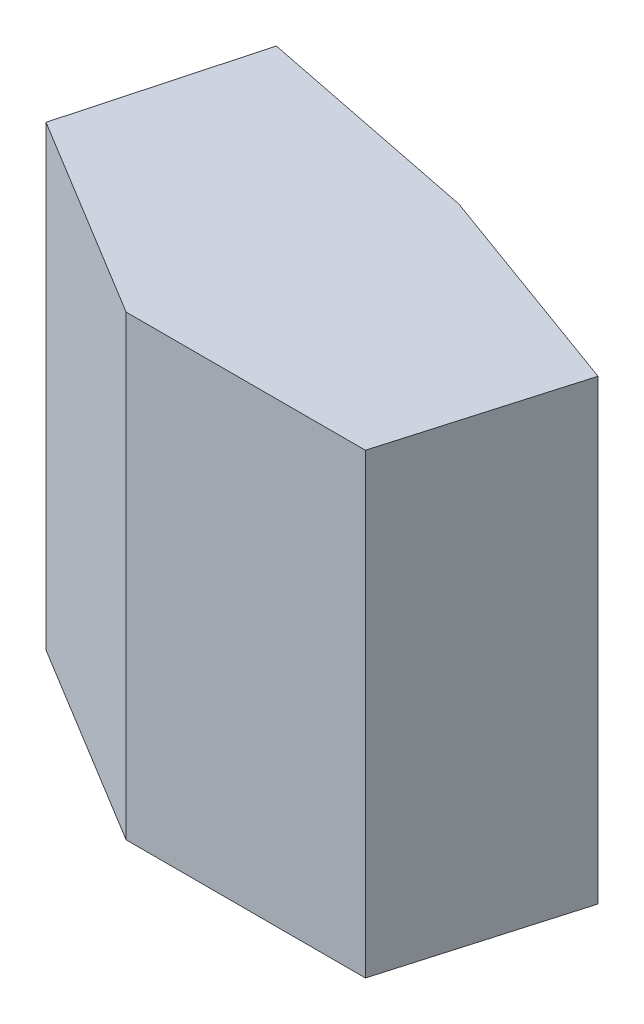
ISO-10303-21;
HEADER;
FILE_DESCRIPTION(('STEP AP214'),'2;1');
FILE_NAME('part.step','',(''),(''),'','','');
FILE_SCHEMA(('AUTOMOTIVE_DESIGN { 1 0 10303 214 1 1 1 1 }'));
ENDSEC;
DATA;
#1=APPLICATION_CONTEXT('core data for automotive mechanical design processes');
#2=APPLICATION_PROTOCOL_DEFINITION('international standard','automotive_design',2000,#1);
#3=PRODUCT_CONTEXT('',#1,'mechanical');
#4=PRODUCT('Part','Part','',(#3));
#5=PRODUCT_RELATED_PRODUCT_CATEGORY('part','',(#4));
#6=PRODUCT_DEFINITION_FORMATION('','',#4);
#7=PRODUCT_DEFINITION_CONTEXT('part definition',#1,'design');
#8=PRODUCT_DEFINITION('design','',#6,#7);
#9=PRODUCT_DEFINITION_SHAPE('','',#8);
#10=(LENGTH_UNIT() NAMED_UNIT(*) SI_UNIT(.MILLI.,.METRE.));
#11=(NAMED_UNIT(*) PLANE_ANGLE_UNIT() SI_UNIT($,.RADIAN.));
#12=(NAMED_UNIT(*) SI_UNIT($,.STERADIAN.) SOLID_ANGLE_UNIT());
#13=UNCERTAINTY_MEASURE_WITH_UNIT(LENGTH_MEASURE(1.E-05),#10,'distance_accuracy_value','');
#14=(GEOMETRIC_REPRESENTATION_CONTEXT(3) GLOBAL_UNCERTAINTY_ASSIGNED_CONTEXT((#13)) GLOBAL_UNIT_ASSIGNED_CONTEXT((#10,
#11,#12)) REPRESENTATION_CONTEXT('',''));
#15=CARTESIAN_POINT('',(0.,0.,0.));
#16=DIRECTION('',(0.,0.,1.));
#17=DIRECTION('',(1.,0.,0.));
#18=AXIS2_PLACEMENT_3D('',#15,#16,#17);
#19=CARTESIAN_POINT('',(-15.5804579930704,6.5,0.));
#20=DIRECTION('',(0.,0.,-1.));
#21=DIRECTION('',(-1.,0.,0.));
#22=AXIS2_PLACEMENT_3D('',#19,#20,#21);
#23=PLANE('',#22);
#24=DIRECTION('',(1.,0.,0.));
#25=VECTOR('',#24,1.);
#26=CARTESIAN_POINT('',(-15.5804579930704,-6.5,0.));
#27=LINE('',#26,#25);
#28=CARTESIAN_POINT('',(-22.3858503910373,-6.5,0.));
#29=VERTEX_POINT('',#28);
#30=CARTESIAN_POINT('',(-15.5804579930704,-6.5,0.));
#31=VERTEX_POINT('',#30);
#32=EDGE_CURVE('E69',#29,#31,#27,.T.);
#33=ORIENTED_EDGE('',*,*,#32,.T.);
#34=DIRECTION('',(0.,-1.,0.));
#35=VECTOR('',#34,1.);
#36=CARTESIAN_POINT('',(-15.5804579930704,6.5,0.));
#37=LINE('',#36,#35);
#38=CARTESIAN_POINT('',(-15.5804579930704,6.5,0.));
#39=VERTEX_POINT('',#38);
#40=EDGE_CURVE('E11',#39,#31,#37,.T.);
#41=ORIENTED_EDGE('',*,*,#40,.F.);
#42=DIRECTION('',(1.,0.,0.));
#43=VECTOR('',#42,1.);
#44=CARTESIAN_POINT('',(-15.5804579930704,6.5,0.));
#45=LINE('',#44,#43);
#46=CARTESIAN_POINT('',(-22.3858503910373,6.5,0.));
#47=VERTEX_POINT('',#46);
#48=EDGE_CURVE('E80',#47,#39,#45,.T.);
#49=ORIENTED_EDGE('',*,*,#48,.F.);
#50=DIRECTION('',(0.,-1.,0.));
#51=VECTOR('',#50,1.);
#52=CARTESIAN_POINT('',(-22.3858503910373,6.5,0.));
#53=LINE('',#52,#51);
#54=EDGE_CURVE('E116',#47,#29,#53,.T.);
#55=ORIENTED_EDGE('',*,*,#54,.T.);
#56=EDGE_LOOP('',(#33,#41,#49,#55));
#57=FACE_BOUND('',#56,.T.);
#58=ADVANCED_FACE('F39',(#57),#23,.F.);
#59=CARTESIAN_POINT('',(-14.0953893117886,6.5,-5.13030214988513));
#60=DIRECTION('',(-0.960565203731033,0.,-0.278054831609091));
#61=DIRECTION('',(-0.278054831609091,0.,0.960565203731033));
#62=AXIS2_PLACEMENT_3D('',#59,#60,#61);
#63=PLANE('',#62);
#64=DIRECTION('',(0.278054831609091,0.,-0.960565203731033));
#65=VECTOR('',#64,1.);
#66=CARTESIAN_POINT('',(-14.0953893117886,-6.5,-5.13030214988513));
#67=LINE('',#66,#65);
#68=CARTESIAN_POINT('',(-14.0953893117886,-6.5,-5.13030214988513));
#69=VERTEX_POINT('',#68);
#70=EDGE_CURVE('E75',#31,#69,#67,.T.);
#71=ORIENTED_EDGE('',*,*,#70,.T.);
#72=DIRECTION('',(0.,-1.,0.));
#73=VECTOR('',#72,1.);
#74=CARTESIAN_POINT('',(-14.0953893117886,6.5,-5.13030214988513));
#75=LINE('',#74,#73);
#76=CARTESIAN_POINT('',(-14.0953893117886,6.5,-5.13030214988513));
#77=VERTEX_POINT('',#76);
#78=EDGE_CURVE('E47',#77,#69,#75,.T.);
#79=ORIENTED_EDGE('',*,*,#78,.F.);
#80=DIRECTION('',(0.278054831609091,0.,-0.960565203731033));
#81=VECTOR('',#80,1.);
#82=CARTESIAN_POINT('',(-14.0953893117886,6.5,-5.13030214988513));
#83=LINE('',#82,#81);
#84=EDGE_CURVE('E135',#39,#77,#83,.T.);
#85=ORIENTED_EDGE('',*,*,#84,.F.);
#86=ORIENTED_EDGE('',*,*,#40,.T.);
#87=EDGE_LOOP('',(#71,#79,#85,#86));
#88=FACE_BOUND('',#87,.T.);
#89=ADVANCED_FACE('F157',(#88),#63,.F.);
#90=CARTESIAN_POINT('',(-20.3143599100768,6.5,-7.39382233543877));
#91=DIRECTION('',(-0.342020143325676,0.,0.939692620785906));
#92=DIRECTION('',(0.939692620785906,0.,0.342020143325676));
#93=AXIS2_PLACEMENT_3D('',#90,#91,#92);
#94=PLANE('',#93);
#95=DIRECTION('',(-0.939692620785906,0.,-0.342020143325676));
#96=VECTOR('',#95,1.);
#97=CARTESIAN_POINT('',(-20.3143599100768,-6.5,-7.39382233543877));
#98=LINE('',#97,#96);
#99=CARTESIAN_POINT('',(-20.3143599100768,-6.5,-7.39382233543878));
#100=VERTEX_POINT('',#99);
#101=EDGE_CURVE('E136',#69,#100,#98,.T.);
#102=ORIENTED_EDGE('',*,*,#101,.T.);
#103=DIRECTION('',(0.,-1.,0.));
#104=VECTOR('',#103,1.);
#105=CARTESIAN_POINT('',(-20.3143599100768,6.5,-7.39382233543878));
#106=LINE('',#105,#104);
#107=CARTESIAN_POINT('',(-20.3143599100768,6.5,-7.39382233543877));
#108=VERTEX_POINT('',#107);
#109=EDGE_CURVE('E126',#108,#100,#106,.T.);
#110=ORIENTED_EDGE('',*,*,#109,.F.);
#111=DIRECTION('',(-0.939692620785906,0.,-0.342020143325676));
#112=VECTOR('',#111,1.);
#113=CARTESIAN_POINT('',(-20.3143599100768,6.5,-7.39382233543877));
#114=LINE('',#113,#112);
#115=EDGE_CURVE('E55',#77,#108,#114,.T.);
#116=ORIENTED_EDGE('',*,*,#115,.F.);
#117=ORIENTED_EDGE('',*,*,#78,.T.);
#118=EDGE_LOOP('',(#102,#110,#116,#117));
#119=FACE_BOUND('',#118,.T.);
#120=ADVANCED_FACE('F143',(#119),#94,.F.);
#121=CARTESIAN_POINT('',(0.,6.5,0.));
#122=DIRECTION('',(0.,-1.,0.));
#123=DIRECTION('',(0.,0.,-1.));
#124=AXIS2_PLACEMENT_3D('',#121,#122,#123);
#125=PLANE('',#124);
#126=ORIENTED_EDGE('',*,*,#115,.T.);
#127=DIRECTION('',(0.98060771989491,0.,0.195980865603013));
#128=VECTOR('',#127,1.);
#129=CARTESIAN_POINT('',(-20.3143599100768,6.5,-7.39382233543878));
#130=LINE('',#129,#128);
#131=CARTESIAN_POINT('',(-26.8041103280172,6.5,-8.69084139683448));
#132=VERTEX_POINT('',#131);
#133=EDGE_CURVE('E103',#132,#108,#130,.T.);
#134=ORIENTED_EDGE('',*,*,#133,.F.);
#135=DIRECTION('',(0.261479751579448,0.,-0.965208961579797));
#136=VECTOR('',#135,1.);
#137=CARTESIAN_POINT('',(-26.8041103280172,6.5,-8.69084139683448));
#138=LINE('',#137,#136);
#139=CARTESIAN_POINT('',(-28.2006528286917,6.5,-3.53573730660992));
#140=VERTEX_POINT('',#139);
#141=EDGE_CURVE('E96',#140,#132,#138,.T.);
#142=ORIENTED_EDGE('',*,*,#141,.F.);
#143=DIRECTION('',(-0.854440434528307,0.,-0.519549366127107));
#144=VECTOR('',#143,1.);
#145=CARTESIAN_POINT('',(-28.2006528286917,6.5,-3.53573730660992));
#146=LINE('',#145,#144);
#147=EDGE_CURVE('E100',#47,#140,#146,.T.);
#148=ORIENTED_EDGE('',*,*,#147,.F.);
#149=ORIENTED_EDGE('',*,*,#48,.T.);
#150=ORIENTED_EDGE('',*,*,#84,.T.);
#151=EDGE_LOOP('',(#126,#134,#142,#148,#149,#150));
#152=FACE_BOUND('',#151,.T.);
#153=ADVANCED_FACE('F98',(#152),#125,.F.);
#154=CARTESIAN_POINT('',(0.,-6.5,0.));
#155=DIRECTION('',(0.,-1.,0.));
#156=DIRECTION('',(0.,0.,-1.));
#157=AXIS2_PLACEMENT_3D('',#154,#155,#156);
#158=PLANE('',#157);
#159=ORIENTED_EDGE('',*,*,#32,.F.);
#160=DIRECTION('',(-0.854440434528307,0.,-0.519549366127107));
#161=VECTOR('',#160,1.);
#162=CARTESIAN_POINT('',(-28.2006528286917,-6.5,-3.53573730660992));
#163=LINE('',#162,#161);
#164=CARTESIAN_POINT('',(-28.2006528286917,-6.5,-3.53573730660992));
#165=VERTEX_POINT('',#164);
#166=EDGE_CURVE('E127',#29,#165,#163,.T.);
#167=ORIENTED_EDGE('',*,*,#166,.T.);
#168=DIRECTION('',(0.261479751579448,0.,-0.965208961579797));
#169=VECTOR('',#168,1.);
#170=CARTESIAN_POINT('',(-26.8041103280172,-6.5,-8.69084139683448));
#171=LINE('',#170,#169);
#172=CARTESIAN_POINT('',(-26.8041103280172,-6.5,-8.69084139683448));
#173=VERTEX_POINT('',#172);
#174=EDGE_CURVE('E112',#165,#173,#171,.T.);
#175=ORIENTED_EDGE('',*,*,#174,.T.);
#176=DIRECTION('',(0.98060771989491,0.,0.195980865603013));
#177=VECTOR('',#176,1.);
#178=CARTESIAN_POINT('',(-20.3143599100768,-6.5,-7.39382233543878));
#179=LINE('',#178,#177);
#180=EDGE_CURVE('E120',#173,#100,#179,.T.);
#181=ORIENTED_EDGE('',*,*,#180,.T.);
#182=ORIENTED_EDGE('',*,*,#101,.F.);
#183=ORIENTED_EDGE('',*,*,#70,.F.);
#184=EDGE_LOOP('',(#159,#167,#175,#181,#182,#183));
#185=FACE_BOUND('',#184,.T.);
#186=ADVANCED_FACE('F146',(#185),#158,.T.);
#187=CARTESIAN_POINT('',(-28.2006528286917,6.5,-3.53573730660992));
#188=DIRECTION('',(0.519549366127107,0.,-0.854440434528306));
#189=DIRECTION('',(0.854440434528307,0.,0.519549366127107));
#190=AXIS2_PLACEMENT_3D('',#187,#188,#189);
#191=PLANE('',#190);
#192=ORIENTED_EDGE('',*,*,#166,.F.);
#193=ORIENTED_EDGE('',*,*,#54,.F.);
#194=ORIENTED_EDGE('',*,*,#147,.T.);
#195=DIRECTION('',(0.,-1.,0.));
#196=VECTOR('',#195,1.);
#197=CARTESIAN_POINT('',(-28.2006528286917,6.5,-3.53573730660992));
#198=LINE('',#197,#196);
#199=EDGE_CURVE('E109',#140,#165,#198,.T.);
#200=ORIENTED_EDGE('',*,*,#199,.T.);
#201=EDGE_LOOP('',(#192,#193,#194,#200));
#202=FACE_BOUND('',#201,.T.);
#203=ADVANCED_FACE('F119',(#202),#191,.F.);
#204=CARTESIAN_POINT('',(-26.8041103280172,6.5,-8.69084139683448));
#205=DIRECTION('',(0.965208961579797,0.,0.261479751579448));
#206=DIRECTION('',(-0.261479751579448,0.,0.965208961579797));
#207=AXIS2_PLACEMENT_3D('',#204,#205,#206);
#208=PLANE('',#207);
#209=ORIENTED_EDGE('',*,*,#174,.F.);
#210=ORIENTED_EDGE('',*,*,#199,.F.);
#211=ORIENTED_EDGE('',*,*,#141,.T.);
#212=DIRECTION('',(0.,-1.,0.));
#213=VECTOR('',#212,1.);
#214=CARTESIAN_POINT('',(-26.8041103280172,6.5,-8.69084139683448));
#215=LINE('',#214,#213);
#216=EDGE_CURVE('E117',#132,#173,#215,.T.);
#217=ORIENTED_EDGE('',*,*,#216,.T.);
#218=EDGE_LOOP('',(#209,#210,#211,#217));
#219=FACE_BOUND('',#218,.T.);
#220=ADVANCED_FACE('F110',(#219),#208,.F.);
#221=CARTESIAN_POINT('',(-20.3143599100768,6.5,-7.39382233543878));
#222=DIRECTION('',(-0.195980865603014,0.,0.980607719894909));
#223=DIRECTION('',(-0.98060771989491,0.,-0.195980865603013));
#224=AXIS2_PLACEMENT_3D('',#221,#222,#223);
#225=PLANE('',#224);
#226=ORIENTED_EDGE('',*,*,#180,.F.);
#227=ORIENTED_EDGE('',*,*,#216,.F.);
#228=ORIENTED_EDGE('',*,*,#133,.T.);
#229=ORIENTED_EDGE('',*,*,#109,.T.);
#230=EDGE_LOOP('',(#226,#227,#228,#229));
#231=FACE_BOUND('',#230,.T.);
#232=ADVANCED_FACE('F148',(#231),#225,.F.);
#233=CLOSED_SHELL('',(#58,#89,#120,#153,#186,#203,#220,#232));
#234=MANIFOLD_SOLID_BREP('B2',#233);
#235=ADVANCED_BREP_SHAPE_REPRESENTATION('',(#18,#234),#14);
#236=SHAPE_DEFINITION_REPRESENTATION(#9,#235);
ENDSEC;
END-ISO-10303-21;
